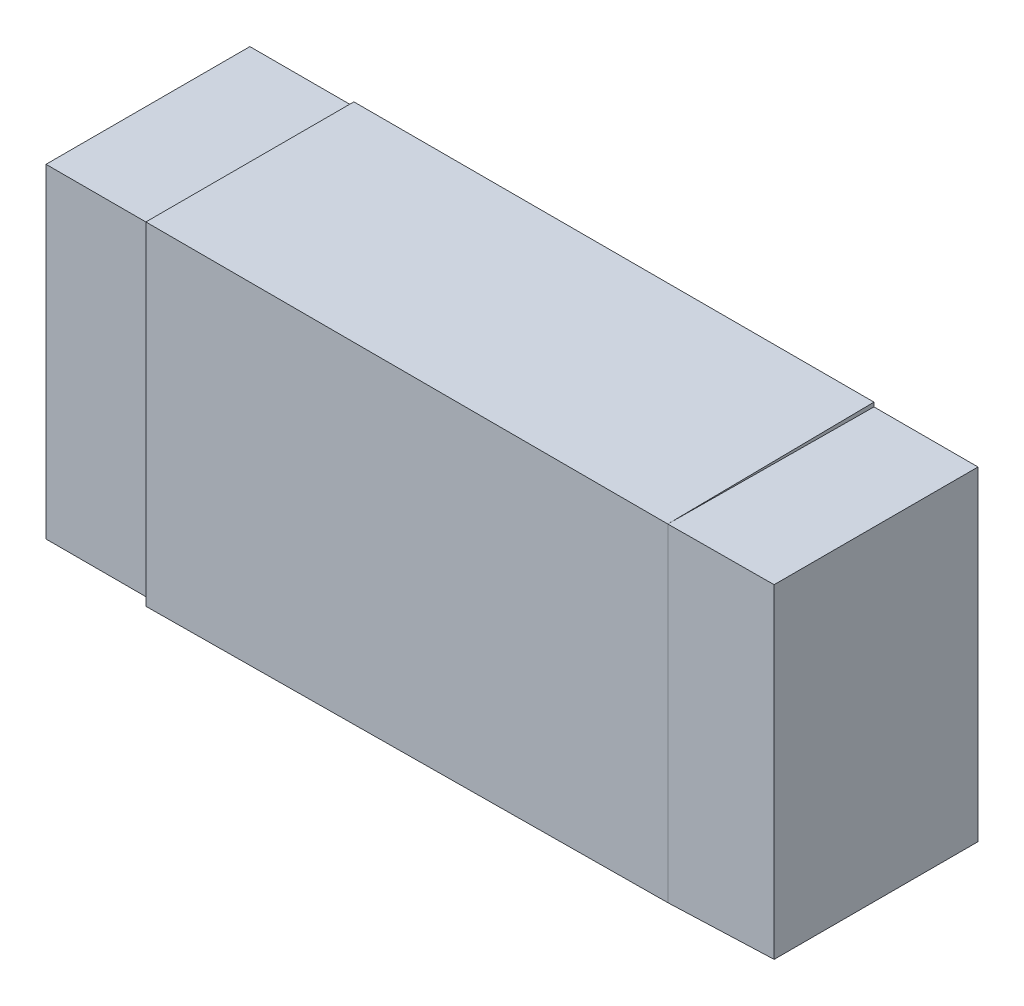
ISO-10303-21;
HEADER;
FILE_DESCRIPTION(('STEP AP214'),'2;1');
FILE_NAME('part.step','',(''),(''),'','','');
FILE_SCHEMA(('AUTOMOTIVE_DESIGN { 1 0 10303 214 1 1 1 1 }'));
ENDSEC;
DATA;
#1=APPLICATION_CONTEXT('core data for automotive mechanical design processes');
#2=APPLICATION_PROTOCOL_DEFINITION('international standard','automotive_design',2000,#1);
#3=PRODUCT_CONTEXT('',#1,'mechanical');
#4=PRODUCT('Part','Part','',(#3));
#5=PRODUCT_RELATED_PRODUCT_CATEGORY('part','',(#4));
#6=PRODUCT_DEFINITION_FORMATION('','',#4);
#7=PRODUCT_DEFINITION_CONTEXT('part definition',#1,'design');
#8=PRODUCT_DEFINITION('design','',#6,#7);
#9=PRODUCT_DEFINITION_SHAPE('','',#8);
#10=(LENGTH_UNIT() NAMED_UNIT(*) SI_UNIT(.MILLI.,.METRE.));
#11=(NAMED_UNIT(*) PLANE_ANGLE_UNIT() SI_UNIT($,.RADIAN.));
#12=(NAMED_UNIT(*) SI_UNIT($,.STERADIAN.) SOLID_ANGLE_UNIT());
#13=UNCERTAINTY_MEASURE_WITH_UNIT(LENGTH_MEASURE(1.E-05),#10,'distance_accuracy_value','');
#14=(GEOMETRIC_REPRESENTATION_CONTEXT(3) GLOBAL_UNCERTAINTY_ASSIGNED_CONTEXT((#13)) GLOBAL_UNIT_ASSIGNED_CONTEXT((#10,
#11,#12)) REPRESENTATION_CONTEXT('',''));
#15=CARTESIAN_POINT('',(0.,0.,0.));
#16=DIRECTION('',(0.,0.,1.));
#17=DIRECTION('',(1.,0.,0.));
#18=AXIS2_PLACEMENT_3D('',#15,#16,#17);
#19=CARTESIAN_POINT('',(0.,0.,0.49));
#20=DIRECTION('',(0.,0.,-1.));
#21=DIRECTION('',(-1.,0.,0.));
#22=AXIS2_PLACEMENT_3D('',#19,#20,#21);
#23=PLANE('',#22);
#24=DIRECTION('',(1.,0.,0.));
#25=VECTOR('',#24,1.);
#26=CARTESIAN_POINT('',(-0.625,0.39,0.49));
#27=LINE('',#26,#25);
#28=CARTESIAN_POINT('',(-0.875,0.39,0.49));
#29=VERTEX_POINT('',#28);
#30=CARTESIAN_POINT('',(-0.625,0.39,0.49));
#31=VERTEX_POINT('',#30);
#32=EDGE_CURVE('E268',#29,#31,#27,.T.);
#33=ORIENTED_EDGE('',*,*,#32,.F.);
#34=DIRECTION('',(0.,-1.,0.));
#35=VECTOR('',#34,1.);
#36=CARTESIAN_POINT('',(-0.875,0.39,0.49));
#37=LINE('',#36,#35);
#38=CARTESIAN_POINT('',(-0.875,-0.39,0.49));
#39=VERTEX_POINT('',#38);
#40=EDGE_CURVE('E259',#39,#29,#37,.F.);
#41=ORIENTED_EDGE('',*,*,#40,.F.);
#42=DIRECTION('',(1.,0.,0.));
#43=VECTOR('',#42,1.);
#44=CARTESIAN_POINT('',(-0.625,-0.39,0.49));
#45=LINE('',#44,#43);
#46=CARTESIAN_POINT('',(-0.625,-0.39,0.49));
#47=VERTEX_POINT('',#46);
#48=EDGE_CURVE('E247',#47,#39,#45,.F.);
#49=ORIENTED_EDGE('',*,*,#48,.F.);
#50=DIRECTION('',(0.,1.,0.));
#51=VECTOR('',#50,1.);
#52=CARTESIAN_POINT('',(-0.625,0.4,0.49));
#53=LINE('',#52,#51);
#54=EDGE_CURVE('E281',#47,#31,#53,.T.);
#55=ORIENTED_EDGE('',*,*,#54,.T.);
#56=EDGE_LOOP('',(#33,#41,#49,#55));
#57=FACE_BOUND('',#56,.T.);
#58=ADVANCED_FACE('F16',(#57),#23,.F.);
#59=CARTESIAN_POINT('',(0.,0.,0.5));
#60=DIRECTION('',(0.,0.,1.));
#61=DIRECTION('',(1.,0.,0.));
#62=AXIS2_PLACEMENT_3D('',#59,#60,#61);
#63=PLANE('',#62);
#64=DIRECTION('',(0.,1.,0.));
#65=VECTOR('',#64,1.);
#66=CARTESIAN_POINT('',(-0.625,0.4,0.5));
#67=LINE('',#66,#65);
#68=CARTESIAN_POINT('',(-0.625,0.4,0.5));
#69=VERTEX_POINT('',#68);
#70=CARTESIAN_POINT('',(-0.625,-0.4,0.5));
#71=VERTEX_POINT('',#70);
#72=EDGE_CURVE('E202',#69,#71,#67,.F.);
#73=ORIENTED_EDGE('',*,*,#72,.T.);
#74=CARTESIAN_POINT('',(-0.625,-0.4,0.5));
#75=DIRECTION('',(1.,0.,0.));
#76=VECTOR('',#75,1.);
#77=LINE('',#74,#76);
#78=CARTESIAN_POINT('',(0.625,-0.395000108849644,0.494670613901245));
#79=VERTEX_POINT('',#78);
#80=EDGE_CURVE('E104',#71,#79,#77,.T.);
#81=ORIENTED_EDGE('',*,*,#80,.T.);
#82=CARTESIAN_POINT('',(0.625,0.39,0.49));
#83=DIRECTION('',(0.,-1.,0.));
#84=VECTOR('',#83,1.);
#85=LINE('',#82,#84);
#86=CARTESIAN_POINT('',(0.625,0.394084235892586,0.495580467183737));
#87=VERTEX_POINT('',#86);
#88=EDGE_CURVE('E98',#87,#79,#85,.T.);
#89=ORIENTED_EDGE('',*,*,#88,.F.);
#90=DIRECTION('',(1.,0.,0.));
#91=VECTOR('',#90,1.);
#92=CARTESIAN_POINT('',(-0.625,0.4,0.5));
#93=LINE('',#92,#91);
#94=EDGE_CURVE('E90',#87,#69,#93,.F.);
#95=ORIENTED_EDGE('',*,*,#94,.T.);
#96=EDGE_LOOP('',(#73,#81,#89,#95));
#97=FACE_BOUND('',#96,.T.);
#98=ADVANCED_FACE('F102',(#97),#63,.T.);
#99=CARTESIAN_POINT('',(0.,0.,0.49));
#100=DIRECTION('',(0.,0.,1.));
#101=DIRECTION('',(1.,0.,0.));
#102=AXIS2_PLACEMENT_3D('',#99,#100,#101);
#103=PLANE('',#102);
#104=DIRECTION('',(0.,1.,0.));
#105=VECTOR('',#104,1.);
#106=CARTESIAN_POINT('',(0.875,0.39,0.49));
#107=LINE('',#106,#105);
#108=CARTESIAN_POINT('',(0.875,0.39,0.49));
#109=VERTEX_POINT('',#108);
#110=CARTESIAN_POINT('',(0.875,-0.39,0.49));
#111=VERTEX_POINT('',#110);
#112=EDGE_CURVE('E120',#109,#111,#107,.F.);
#113=ORIENTED_EDGE('',*,*,#112,.F.);
#114=DIRECTION('',(-1.,0.,0.));
#115=VECTOR('',#114,1.);
#116=CARTESIAN_POINT('',(0.625,0.39,0.49));
#117=LINE('',#116,#115);
#118=EDGE_CURVE('E118',#87,#109,#117,.F.);
#119=ORIENTED_EDGE('',*,*,#118,.F.);
#120=ORIENTED_EDGE('',*,*,#88,.T.);
#121=CARTESIAN_POINT('',(0.875,-0.39,0.49));
#122=DIRECTION('',(-0.9999000149975,0.,0.0141407216222653));
#123=VECTOR('',#122,1.);
#124=LINE('',#121,#123);
#125=EDGE_CURVE('E322',#111,#79,#124,.T.);
#126=ORIENTED_EDGE('',*,*,#125,.F.);
#127=EDGE_LOOP('',(#113,#119,#120,#126));
#128=FACE_BOUND('',#127,.T.);
#129=ADVANCED_FACE('F119',(#128),#103,.T.);
#130=CARTESIAN_POINT('',(-0.625,0.4,0.5));
#131=DIRECTION('',(0.,-1.,0.));
#132=DIRECTION('',(0.,0.,-1.));
#133=AXIS2_PLACEMENT_3D('',#130,#131,#132);
#134=PLANE('',#133);
#135=DIRECTION('',(0.,0.,1.));
#136=VECTOR('',#135,1.);
#137=CARTESIAN_POINT('',(-0.625,0.4,0.5));
#138=LINE('',#137,#136);
#139=CARTESIAN_POINT('',(-0.625,0.4,0.));
#140=VERTEX_POINT('',#139);
#141=EDGE_CURVE('E95',#140,#69,#138,.T.);
#142=ORIENTED_EDGE('',*,*,#141,.T.);
#143=ORIENTED_EDGE('',*,*,#94,.F.);
#144=DIRECTION('',(0.,0.,1.));
#145=VECTOR('',#144,1.);
#146=CARTESIAN_POINT('',(0.625,0.4,0.5));
#147=LINE('',#146,#145);
#148=CARTESIAN_POINT('',(0.625,0.4,0.));
#149=VERTEX_POINT('',#148);
#150=EDGE_CURVE('E94',#87,#149,#147,.F.);
#151=ORIENTED_EDGE('',*,*,#150,.T.);
#152=DIRECTION('',(1.,0.,0.));
#153=VECTOR('',#152,1.);
#154=CARTESIAN_POINT('',(0.,0.4,0.));
#155=LINE('',#154,#153);
#156=EDGE_CURVE('E128',#149,#140,#155,.F.);
#157=ORIENTED_EDGE('',*,*,#156,.T.);
#158=EDGE_LOOP('',(#142,#143,#151,#157));
#159=FACE_BOUND('',#158,.T.);
#160=ADVANCED_FACE('F92',(#159),#134,.F.);
#161=CARTESIAN_POINT('',(-0.625,0.4,0.5));
#162=DIRECTION('',(1.,0.,0.));
#163=DIRECTION('',(0.,1.,0.));
#164=AXIS2_PLACEMENT_3D('',#161,#162,#163);
#165=PLANE('',#164);
#166=ORIENTED_EDGE('',*,*,#54,.F.);
#167=DIRECTION('',(0.,0.,-1.));
#168=VECTOR('',#167,1.);
#169=CARTESIAN_POINT('',(-0.625,-0.39,0.49));
#170=LINE('',#169,#168);
#171=CARTESIAN_POINT('',(-0.625,-0.395,0.));
#172=VERTEX_POINT('',#171);
#173=EDGE_CURVE('E245',#172,#47,#170,.F.);
#174=ORIENTED_EDGE('',*,*,#173,.F.);
#175=DIRECTION('',(0.,0.,1.));
#176=VECTOR('',#175,1.);
#177=CARTESIAN_POINT('',(-0.625,-0.4,0.5));
#178=LINE('',#177,#176);
#179=EDGE_CURVE('E253',#172,#71,#178,.T.);
#180=ORIENTED_EDGE('',*,*,#179,.T.);
#181=ORIENTED_EDGE('',*,*,#72,.F.);
#182=ORIENTED_EDGE('',*,*,#141,.F.);
#183=DIRECTION('',(0.,1.,0.));
#184=VECTOR('',#183,1.);
#185=CARTESIAN_POINT('',(-0.625,0.,0.));
#186=LINE('',#185,#184);
#187=CARTESIAN_POINT('',(-0.625,0.39,0.));
#188=VERTEX_POINT('',#187);
#189=EDGE_CURVE('E130',#140,#188,#186,.F.);
#190=ORIENTED_EDGE('',*,*,#189,.T.);
#191=DIRECTION('',(0.,0.,1.));
#192=VECTOR('',#191,1.);
#193=CARTESIAN_POINT('',(-0.625,0.39,0.49));
#194=LINE('',#193,#192);
#195=EDGE_CURVE('E266',#31,#188,#194,.F.);
#196=ORIENTED_EDGE('',*,*,#195,.F.);
#197=EDGE_LOOP('',(#166,#174,#180,#181,#182,#190,#196));
#198=FACE_BOUND('',#197,.T.);
#199=ADVANCED_FACE('F320',(#198),#165,.F.);
#200=CARTESIAN_POINT('',(-0.625,0.39,0.49));
#201=DIRECTION('',(0.,1.,0.));
#202=DIRECTION('',(0.,0.,1.));
#203=AXIS2_PLACEMENT_3D('',#200,#201,#202);
#204=PLANE('',#203);
#205=ORIENTED_EDGE('',*,*,#32,.T.);
#206=ORIENTED_EDGE('',*,*,#195,.T.);
#207=DIRECTION('',(1.,0.,0.));
#208=VECTOR('',#207,1.);
#209=CARTESIAN_POINT('',(0.,0.39,0.));
#210=LINE('',#209,#208);
#211=CARTESIAN_POINT('',(-0.875,0.39,0.));
#212=VERTEX_POINT('',#211);
#213=EDGE_CURVE('E237',#188,#212,#210,.F.);
#214=ORIENTED_EDGE('',*,*,#213,.T.);
#215=DIRECTION('',(0.,0.,1.));
#216=VECTOR('',#215,1.);
#217=CARTESIAN_POINT('',(-0.875,0.39,0.49));
#218=LINE('',#217,#216);
#219=EDGE_CURVE('E248',#29,#212,#218,.F.);
#220=ORIENTED_EDGE('',*,*,#219,.F.);
#221=EDGE_LOOP('',(#205,#206,#214,#220));
#222=FACE_BOUND('',#221,.T.);
#223=ADVANCED_FACE('F314',(#222),#204,.T.);
#224=CARTESIAN_POINT('',(-0.875,0.39,0.49));
#225=DIRECTION('',(-1.,0.,0.));
#226=DIRECTION('',(0.,-1.,0.));
#227=AXIS2_PLACEMENT_3D('',#224,#225,#226);
#228=PLANE('',#227);
#229=ORIENTED_EDGE('',*,*,#40,.T.);
#230=ORIENTED_EDGE('',*,*,#219,.T.);
#231=DIRECTION('',(0.,1.,0.));
#232=VECTOR('',#231,1.);
#233=CARTESIAN_POINT('',(-0.875,0.,0.));
#234=LINE('',#233,#232);
#235=CARTESIAN_POINT('',(-0.875,-0.39,0.));
#236=VERTEX_POINT('',#235);
#237=EDGE_CURVE('E231',#212,#236,#234,.F.);
#238=ORIENTED_EDGE('',*,*,#237,.T.);
#239=DIRECTION('',(0.,0.,-1.));
#240=VECTOR('',#239,1.);
#241=CARTESIAN_POINT('',(-0.875,-0.39,0.49));
#242=LINE('',#241,#240);
#243=EDGE_CURVE('E251',#39,#236,#242,.T.);
#244=ORIENTED_EDGE('',*,*,#243,.F.);
#245=EDGE_LOOP('',(#229,#230,#238,#244));
#246=FACE_BOUND('',#245,.T.);
#247=ADVANCED_FACE('F310',(#246),#228,.T.);
#248=CARTESIAN_POINT('',(-0.625,-0.39,0.49));
#249=DIRECTION('',(0.,-1.,0.));
#250=DIRECTION('',(0.,0.,-1.));
#251=AXIS2_PLACEMENT_3D('',#248,#249,#250);
#252=PLANE('',#251);
#253=ORIENTED_EDGE('',*,*,#48,.T.);
#254=ORIENTED_EDGE('',*,*,#243,.T.);
#255=DIRECTION('',(1.,0.,0.));
#256=VECTOR('',#255,1.);
#257=CARTESIAN_POINT('',(0.,-0.39,0.));
#258=LINE('',#257,#256);
#259=EDGE_CURVE('E228',#236,#172,#258,.T.);
#260=ORIENTED_EDGE('',*,*,#259,.T.);
#261=ORIENTED_EDGE('',*,*,#173,.T.);
#262=EDGE_LOOP('',(#253,#254,#260,#261));
#263=FACE_BOUND('',#262,.T.);
#264=ADVANCED_FACE('F390',(#263),#252,.T.);
#265=CARTESIAN_POINT('',(-0.625,-0.4,0.5));
#266=DIRECTION('',(0.,1.,0.));
#267=DIRECTION('',(0.,0.,1.));
#268=AXIS2_PLACEMENT_3D('',#265,#266,#267);
#269=PLANE('',#268);
#270=CARTESIAN_POINT('',(0.625,-0.39,0.493535533905933));
#271=DIRECTION('',(0.,0.,-1.));
#272=VECTOR('',#271,1.);
#273=LINE('',#270,#272);
#274=CARTESIAN_POINT('',(0.625,-0.394999999999999,0.));
#275=VERTEX_POINT('',#274);
#276=EDGE_CURVE('E146',#79,#275,#273,.T.);
#277=ORIENTED_EDGE('',*,*,#276,.F.);
#278=ORIENTED_EDGE('',*,*,#80,.F.);
#279=ORIENTED_EDGE('',*,*,#179,.F.);
#280=DIRECTION('',(1.,0.,0.));
#281=VECTOR('',#280,1.);
#282=CARTESIAN_POINT('',(-0.625,-0.4,0.));
#283=LINE('',#282,#281);
#284=EDGE_CURVE('E225',#172,#275,#283,.T.);
#285=ORIENTED_EDGE('',*,*,#284,.T.);
#286=EDGE_LOOP('',(#277,#278,#279,#285));
#287=FACE_BOUND('',#286,.T.);
#288=ADVANCED_FACE('F172',(#287),#269,.F.);
#289=CARTESIAN_POINT('',(0.625,-0.39,0.49));
#290=DIRECTION('',(0.,-1.,0.));
#291=DIRECTION('',(1.,0.,0.));
#292=AXIS2_PLACEMENT_3D('',#289,#290,#291);
#293=PLANE('',#292);
#294=ORIENTED_EDGE('',*,*,#125,.T.);
#295=ORIENTED_EDGE('',*,*,#276,.T.);
#296=DIRECTION('',(1.,0.,0.));
#297=VECTOR('',#296,1.);
#298=CARTESIAN_POINT('',(0.625,-0.39,0.));
#299=LINE('',#298,#297);
#300=CARTESIAN_POINT('',(0.875,-0.39,0.));
#301=VERTEX_POINT('',#300);
#302=EDGE_CURVE('E218',#275,#301,#299,.T.);
#303=ORIENTED_EDGE('',*,*,#302,.T.);
#304=DIRECTION('',(0.,0.,1.));
#305=VECTOR('',#304,1.);
#306=CARTESIAN_POINT('',(0.875,-0.39,0.49));
#307=LINE('',#306,#305);
#308=EDGE_CURVE('E123',#111,#301,#307,.F.);
#309=ORIENTED_EDGE('',*,*,#308,.F.);
#310=EDGE_LOOP('',(#294,#295,#303,#309));
#311=FACE_BOUND('',#310,.T.);
#312=ADVANCED_FACE('F161',(#311),#293,.T.);
#313=CARTESIAN_POINT('',(0.875,0.39,0.49));
#314=DIRECTION('',(1.,0.,0.));
#315=DIRECTION('',(0.,1.,0.));
#316=AXIS2_PLACEMENT_3D('',#313,#314,#315);
#317=PLANE('',#316);
#318=ORIENTED_EDGE('',*,*,#112,.T.);
#319=ORIENTED_EDGE('',*,*,#308,.T.);
#320=DIRECTION('',(0.,1.,0.));
#321=VECTOR('',#320,1.);
#322=CARTESIAN_POINT('',(0.875,0.,0.));
#323=LINE('',#322,#321);
#324=CARTESIAN_POINT('',(0.875,0.39,0.));
#325=VERTEX_POINT('',#324);
#326=EDGE_CURVE('E140',#301,#325,#323,.T.);
#327=ORIENTED_EDGE('',*,*,#326,.T.);
#328=DIRECTION('',(0.,0.,1.));
#329=VECTOR('',#328,1.);
#330=CARTESIAN_POINT('',(0.875,0.39,0.49));
#331=LINE('',#330,#329);
#332=EDGE_CURVE('E115',#109,#325,#331,.F.);
#333=ORIENTED_EDGE('',*,*,#332,.F.);
#334=EDGE_LOOP('',(#318,#319,#327,#333));
#335=FACE_BOUND('',#334,.T.);
#336=ADVANCED_FACE('F171',(#335),#317,.T.);
#337=CARTESIAN_POINT('',(0.625,0.39,0.49));
#338=DIRECTION('',(0.,1.,0.));
#339=DIRECTION('',(-1.,0.,0.));
#340=AXIS2_PLACEMENT_3D('',#337,#338,#339);
#341=PLANE('',#340);
#342=ORIENTED_EDGE('',*,*,#118,.T.);
#343=ORIENTED_EDGE('',*,*,#332,.T.);
#344=DIRECTION('',(1.,0.,0.));
#345=VECTOR('',#344,1.);
#346=CARTESIAN_POINT('',(0.,0.39,0.));
#347=LINE('',#346,#345);
#348=CARTESIAN_POINT('',(0.625,0.39,0.));
#349=VERTEX_POINT('',#348);
#350=EDGE_CURVE('E25',#325,#349,#347,.F.);
#351=ORIENTED_EDGE('',*,*,#350,.T.);
#352=DIRECTION('',(0.,0.,1.));
#353=VECTOR('',#352,1.);
#354=CARTESIAN_POINT('',(0.625,0.39,0.5));
#355=LINE('',#354,#353);
#356=EDGE_CURVE('E33',#349,#87,#355,.T.);
#357=ORIENTED_EDGE('',*,*,#356,.T.);
#358=EDGE_LOOP('',(#342,#343,#351,#357));
#359=FACE_BOUND('',#358,.T.);
#360=ADVANCED_FACE('F126',(#359),#341,.T.);
#361=CARTESIAN_POINT('',(0.625,0.4,0.5));
#362=DIRECTION('',(-1.,0.,0.));
#363=DIRECTION('',(0.,-1.,0.));
#364=AXIS2_PLACEMENT_3D('',#361,#362,#363);
#365=PLANE('',#364);
#366=ORIENTED_EDGE('',*,*,#356,.F.);
#367=DIRECTION('',(0.,1.,0.));
#368=VECTOR('',#367,1.);
#369=CARTESIAN_POINT('',(0.625,0.,0.));
#370=LINE('',#369,#368);
#371=EDGE_CURVE('E11',#349,#149,#370,.T.);
#372=ORIENTED_EDGE('',*,*,#371,.T.);
#373=ORIENTED_EDGE('',*,*,#150,.F.);
#374=EDGE_LOOP('',(#366,#372,#373));
#375=FACE_BOUND('',#374,.T.);
#376=ADVANCED_FACE('F114',(#375),#365,.F.);
#377=CARTESIAN_POINT('',(0.,0.,0.));
#378=DIRECTION('',(0.,0.,1.));
#379=DIRECTION('',(1.,0.,0.));
#380=AXIS2_PLACEMENT_3D('',#377,#378,#379);
#381=PLANE('',#380);
#382=ORIENTED_EDGE('',*,*,#350,.F.);
#383=ORIENTED_EDGE('',*,*,#326,.F.);
#384=ORIENTED_EDGE('',*,*,#302,.F.);
#385=ORIENTED_EDGE('',*,*,#284,.F.);
#386=ORIENTED_EDGE('',*,*,#259,.F.);
#387=ORIENTED_EDGE('',*,*,#237,.F.);
#388=ORIENTED_EDGE('',*,*,#213,.F.);
#389=ORIENTED_EDGE('',*,*,#189,.F.);
#390=ORIENTED_EDGE('',*,*,#156,.F.);
#391=ORIENTED_EDGE('',*,*,#371,.F.);
#392=EDGE_LOOP('',(#382,#383,#384,#385,#386,#387,#388,#389,#390,#391));
#393=FACE_BOUND('',#392,.T.);
#394=ADVANCED_FACE('F318',(#393),#381,.F.);
#395=CLOSED_SHELL('',(#58,#98,#129,#160,#199,#223,#247,#264,#288,#312,#336,#360,#376,#394));
#396=MANIFOLD_SOLID_BREP('B1',#395);
#397=ADVANCED_BREP_SHAPE_REPRESENTATION('',(#18,#396),#14);
#398=SHAPE_DEFINITION_REPRESENTATION(#9,#397);
ENDSEC;
END-ISO-10303-21;
